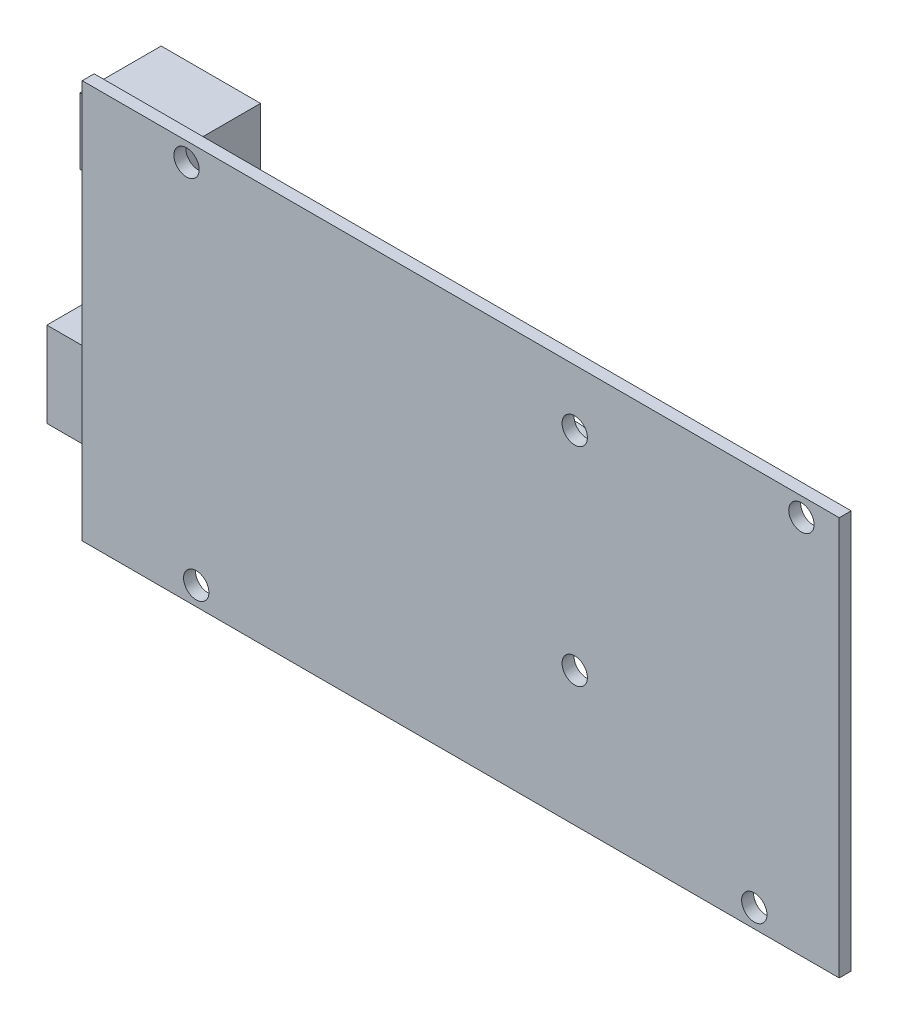
ISO-10303-21;
HEADER;
FILE_DESCRIPTION(('STEP AP214'),'2;1');
FILE_NAME('part.step','',(''),(''),'','','');
FILE_SCHEMA(('AUTOMOTIVE_DESIGN { 1 0 10303 214 1 1 1 1 }'));
ENDSEC;
DATA;
#1=APPLICATION_CONTEXT('core data for automotive mechanical design processes');
#2=APPLICATION_PROTOCOL_DEFINITION('international standard','automotive_design',2000,#1);
#3=PRODUCT_CONTEXT('',#1,'mechanical');
#4=PRODUCT('Part','Part','',(#3));
#5=PRODUCT_RELATED_PRODUCT_CATEGORY('part','',(#4));
#6=PRODUCT_DEFINITION_FORMATION('','',#4);
#7=PRODUCT_DEFINITION_CONTEXT('part definition',#1,'design');
#8=PRODUCT_DEFINITION('design','',#6,#7);
#9=PRODUCT_DEFINITION_SHAPE('','',#8);
#10=(LENGTH_UNIT() NAMED_UNIT(*) SI_UNIT(.MILLI.,.METRE.));
#11=(NAMED_UNIT(*) PLANE_ANGLE_UNIT() SI_UNIT($,.RADIAN.));
#12=(NAMED_UNIT(*) SI_UNIT($,.STERADIAN.) SOLID_ANGLE_UNIT());
#13=UNCERTAINTY_MEASURE_WITH_UNIT(LENGTH_MEASURE(1.E-05),#10,'distance_accuracy_value','');
#14=(GEOMETRIC_REPRESENTATION_CONTEXT(3) GLOBAL_UNCERTAINTY_ASSIGNED_CONTEXT((#13)) GLOBAL_UNIT_ASSIGNED_CONTEXT((#10,
#11,#12)) REPRESENTATION_CONTEXT('',''));
#15=CARTESIAN_POINT('',(0.,0.,0.));
#16=DIRECTION('',(0.,0.,1.));
#17=DIRECTION('',(1.,0.,0.));
#18=AXIS2_PLACEMENT_3D('',#15,#16,#17);
#19=CARTESIAN_POINT('',(0.,0.,0.));
#20=DIRECTION('',(0.,0.,-1.));
#21=DIRECTION('',(-1.,0.,0.));
#22=AXIS2_PLACEMENT_3D('',#19,#20,#21);
#23=PLANE('',#22);
#24=CARTESIAN_POINT('',(0.,0.,0.));
#25=DIRECTION('',(0.,0.,-1.));
#26=DIRECTION('',(-1.,0.,0.));
#27=AXIS2_PLACEMENT_3D('',#24,#25,#26);
#28=CIRCLE('',#27,4.65843090917835);
#29=CARTESIAN_POINT('',(-4.65843090917835,0.,0.));
#30=VERTEX_POINT('',#29);
#31=EDGE_CURVE('E312',#30,#30,#28,.T.);
#32=ORIENTED_EDGE('',*,*,#31,.F.);
#33=EDGE_LOOP('',(#32));
#34=FACE_BOUND('',#33,.T.);
#35=CARTESIAN_POINT('',(15.3,19.1500000000001,0.));
#36=DIRECTION('',(0.,0.,-1.));
#37=DIRECTION('',(-1.,0.,0.));
#38=AXIS2_PLACEMENT_3D('',#35,#36,#37);
#39=CIRCLE('',#38,1.69999999999999);
#40=CARTESIAN_POINT('',(13.6,19.1500000000001,0.));
#41=VERTEX_POINT('',#40);
#42=EDGE_CURVE('E197',#41,#41,#39,.T.);
#43=ORIENTED_EDGE('',*,*,#42,.F.);
#44=EDGE_LOOP('',(#43));
#45=FACE_BOUND('',#44,.T.);
#46=CARTESIAN_POINT('',(45.72,24.2500000000001,0.));
#47=DIRECTION('',(0.,0.,-1.));
#48=DIRECTION('',(-1.,0.,0.));
#49=AXIS2_PLACEMENT_3D('',#46,#47,#48);
#50=CIRCLE('',#49,1.69999999999999);
#51=CARTESIAN_POINT('',(44.02,24.2500000000001,0.));
#52=VERTEX_POINT('',#51);
#53=EDGE_CURVE('E203',#52,#52,#50,.T.);
#54=ORIENTED_EDGE('',*,*,#53,.F.);
#55=EDGE_LOOP('',(#54));
#56=FACE_BOUND('',#55,.T.);
#57=CARTESIAN_POINT('',(15.3,-8.74999999999994,0.));
#58=DIRECTION('',(0.,0.,-1.));
#59=DIRECTION('',(-1.,0.,0.));
#60=AXIS2_PLACEMENT_3D('',#57,#58,#59);
#61=CIRCLE('',#60,1.69999999999999);
#62=CARTESIAN_POINT('',(13.6,-8.74999999999994,0.));
#63=VERTEX_POINT('',#62);
#64=EDGE_CURVE('E209',#63,#63,#61,.T.);
#65=ORIENTED_EDGE('',*,*,#64,.F.);
#66=EDGE_LOOP('',(#65));
#67=FACE_BOUND('',#66,.T.);
#68=CARTESIAN_POINT('',(39.4,-24.25,0.));
#69=DIRECTION('',(0.,0.,-1.));
#70=DIRECTION('',(-1.,0.,0.));
#71=AXIS2_PLACEMENT_3D('',#68,#69,#70);
#72=CIRCLE('',#71,1.69999999999999);
#73=CARTESIAN_POINT('',(37.7,-24.25,0.));
#74=VERTEX_POINT('',#73);
#75=EDGE_CURVE('E215',#74,#74,#72,.T.);
#76=ORIENTED_EDGE('',*,*,#75,.F.);
#77=EDGE_LOOP('',(#76));
#78=FACE_BOUND('',#77,.T.);
#79=CARTESIAN_POINT('',(-35.5,-24.2500000000001,0.));
#80=DIRECTION('',(0.,0.,-1.));
#81=DIRECTION('',(-1.,0.,0.));
#82=AXIS2_PLACEMENT_3D('',#79,#80,#81);
#83=CIRCLE('',#82,1.69999999999999);
#84=CARTESIAN_POINT('',(-37.2,-24.2500000000001,0.));
#85=VERTEX_POINT('',#84);
#86=EDGE_CURVE('E221',#85,#85,#83,.T.);
#87=ORIENTED_EDGE('',*,*,#86,.F.);
#88=EDGE_LOOP('',(#87));
#89=FACE_BOUND('',#88,.T.);
#90=CARTESIAN_POINT('',(-36.8,24.2500000000001,0.));
#91=DIRECTION('',(0.,0.,-1.));
#92=DIRECTION('',(-1.,0.,0.));
#93=AXIS2_PLACEMENT_3D('',#90,#91,#92);
#94=CIRCLE('',#93,1.69999999999999);
#95=CARTESIAN_POINT('',(-38.5,24.2500000000001,0.));
#96=VERTEX_POINT('',#95);
#97=EDGE_CURVE('E227',#96,#96,#94,.T.);
#98=ORIENTED_EDGE('',*,*,#97,.F.);
#99=EDGE_LOOP('',(#98));
#100=FACE_BOUND('',#99,.T.);
#101=DIRECTION('',(0.,-1.,0.));
#102=VECTOR('',#101,1.);
#103=CARTESIAN_POINT('',(-50.8,-26.75,0.));
#104=LINE('',#103,#102);
#105=CARTESIAN_POINT('',(-50.8,14.6850000000001,0.));
#106=VERTEX_POINT('',#105);
#107=CARTESIAN_POINT('',(-50.8,-5.63499999999995,0.));
#108=VERTEX_POINT('',#107);
#109=EDGE_CURVE('E254',#106,#108,#104,.T.);
#110=ORIENTED_EDGE('',*,*,#109,.F.);
#111=DIRECTION('',(-1.,0.,0.));
#112=VECTOR('',#111,1.);
#113=CARTESIAN_POINT('',(-39.37,14.6850000000001,0.));
#114=LINE('',#113,#112);
#115=CARTESIAN_POINT('',(-39.37,14.6850000000001,0.));
#116=VERTEX_POINT('',#115);
#117=EDGE_CURVE('E307',#116,#106,#114,.T.);
#118=ORIENTED_EDGE('',*,*,#117,.F.);
#119=DIRECTION('',(0.,-1.,0.));
#120=VECTOR('',#119,1.);
#121=CARTESIAN_POINT('',(-39.37,14.6850000000001,0.));
#122=LINE('',#121,#120);
#123=CARTESIAN_POINT('',(-39.37,23.575,0.));
#124=VERTEX_POINT('',#123);
#125=EDGE_CURVE('E159',#124,#116,#122,.T.);
#126=ORIENTED_EDGE('',*,*,#125,.F.);
#127=DIRECTION('',(-1.,0.,0.));
#128=VECTOR('',#127,1.);
#129=CARTESIAN_POINT('',(0.,23.575,0.));
#130=LINE('',#129,#128);
#131=CARTESIAN_POINT('',(-50.8,23.5750000000001,0.));
#132=VERTEX_POINT('',#131);
#133=EDGE_CURVE('E11',#124,#132,#130,.T.);
#134=ORIENTED_EDGE('',*,*,#133,.T.);
#135=CARTESIAN_POINT('',(-50.8,26.75,0.));
#136=VERTEX_POINT('',#135);
#137=EDGE_CURVE('E250',#136,#132,#104,.T.);
#138=ORIENTED_EDGE('',*,*,#137,.F.);
#139=DIRECTION('',(-1.,0.,0.));
#140=VECTOR('',#139,1.);
#141=CARTESIAN_POINT('',(-50.8,26.75,0.));
#142=LINE('',#141,#140);
#143=CARTESIAN_POINT('',(50.8,26.75,0.));
#144=VERTEX_POINT('',#143);
#145=EDGE_CURVE('E247',#144,#136,#142,.T.);
#146=ORIENTED_EDGE('',*,*,#145,.F.);
#147=DIRECTION('',(0.,1.,0.));
#148=VECTOR('',#147,1.);
#149=CARTESIAN_POINT('',(50.8,-26.75,0.));
#150=LINE('',#149,#148);
#151=CARTESIAN_POINT('',(50.8,-26.75,0.));
#152=VERTEX_POINT('',#151);
#153=EDGE_CURVE('E233',#152,#144,#150,.T.);
#154=ORIENTED_EDGE('',*,*,#153,.F.);
#155=DIRECTION('',(1.,0.,0.));
#156=VECTOR('',#155,1.);
#157=CARTESIAN_POINT('',(-50.8,-26.75,0.));
#158=LINE('',#157,#156);
#159=CARTESIAN_POINT('',(-50.8,-26.75,0.));
#160=VERTEX_POINT('',#159);
#161=EDGE_CURVE('E238',#160,#152,#158,.T.);
#162=ORIENTED_EDGE('',*,*,#161,.F.);
#163=CARTESIAN_POINT('',(-50.8,-17.0649999999999,0.));
#164=VERTEX_POINT('',#163);
#165=EDGE_CURVE('E249',#164,#160,#104,.T.);
#166=ORIENTED_EDGE('',*,*,#165,.F.);
#167=DIRECTION('',(-1.,0.,0.));
#168=VECTOR('',#167,1.);
#169=CARTESIAN_POINT('',(-41.275,-17.0649999999999,0.));
#170=LINE('',#169,#168);
#171=CARTESIAN_POINT('',(-41.275,-17.0649999999999,0.));
#172=VERTEX_POINT('',#171);
#173=EDGE_CURVE('E179',#172,#164,#170,.T.);
#174=ORIENTED_EDGE('',*,*,#173,.F.);
#175=DIRECTION('',(0.,-1.,0.));
#176=VECTOR('',#175,1.);
#177=CARTESIAN_POINT('',(-41.275,-17.0649999999999,0.));
#178=LINE('',#177,#176);
#179=CARTESIAN_POINT('',(-41.275,-5.63499999999995,0.));
#180=VERTEX_POINT('',#179);
#181=EDGE_CURVE('E56',#180,#172,#178,.T.);
#182=ORIENTED_EDGE('',*,*,#181,.F.);
#183=DIRECTION('',(1.,0.,0.));
#184=VECTOR('',#183,1.);
#185=CARTESIAN_POINT('',(-41.275,-5.63499999999995,0.));
#186=LINE('',#185,#184);
#187=EDGE_CURVE('E41',#108,#180,#186,.T.);
#188=ORIENTED_EDGE('',*,*,#187,.F.);
#189=EDGE_LOOP('',(#110,#118,#126,#134,#138,#146,#154,#162,#166,#174,#182,#188));
#190=FACE_BOUND('',#189,.T.);
#191=ADVANCED_FACE('F33',(#34,#45,#56,#67,#78,#89,#100,#190),#23,.T.);
#192=CARTESIAN_POINT('',(50.8,-26.75,1.6));
#193=DIRECTION('',(-1.,0.,0.));
#194=DIRECTION('',(0.,0.,1.));
#195=AXIS2_PLACEMENT_3D('',#192,#193,#194);
#196=PLANE('',#195);
#197=ORIENTED_EDGE('',*,*,#153,.T.);
#198=DIRECTION('',(0.,0.,-1.));
#199=VECTOR('',#198,1.);
#200=CARTESIAN_POINT('',(50.8,26.75,1.6));
#201=LINE('',#200,#199);
#202=CARTESIAN_POINT('',(50.8,26.75,1.6));
#203=VERTEX_POINT('',#202);
#204=EDGE_CURVE('E264',#203,#144,#201,.T.);
#205=ORIENTED_EDGE('',*,*,#204,.F.);
#206=DIRECTION('',(0.,1.,0.));
#207=VECTOR('',#206,1.);
#208=CARTESIAN_POINT('',(50.8,-26.75,1.6));
#209=LINE('',#208,#207);
#210=CARTESIAN_POINT('',(50.8,-26.75,1.6));
#211=VERTEX_POINT('',#210);
#212=EDGE_CURVE('E234',#211,#203,#209,.T.);
#213=ORIENTED_EDGE('',*,*,#212,.F.);
#214=DIRECTION('',(0.,0.,-1.));
#215=VECTOR('',#214,1.);
#216=CARTESIAN_POINT('',(50.8,-26.75,1.6));
#217=LINE('',#216,#215);
#218=EDGE_CURVE('E244',#211,#152,#217,.T.);
#219=ORIENTED_EDGE('',*,*,#218,.T.);
#220=EDGE_LOOP('',(#197,#205,#213,#219));
#221=FACE_BOUND('',#220,.T.);
#222=ADVANCED_FACE('F35',(#221),#196,.F.);
#223=CARTESIAN_POINT('',(-50.8,26.75,1.6));
#224=DIRECTION('',(0.,-1.,0.));
#225=DIRECTION('',(0.,0.,-1.));
#226=AXIS2_PLACEMENT_3D('',#223,#224,#225);
#227=PLANE('',#226);
#228=ORIENTED_EDGE('',*,*,#145,.T.);
#229=DIRECTION('',(0.,0.,-1.));
#230=VECTOR('',#229,1.);
#231=CARTESIAN_POINT('',(-50.8,26.75,1.6));
#232=LINE('',#231,#230);
#233=CARTESIAN_POINT('',(-50.8,26.75,1.6));
#234=VERTEX_POINT('',#233);
#235=EDGE_CURVE('E262',#234,#136,#232,.T.);
#236=ORIENTED_EDGE('',*,*,#235,.F.);
#237=DIRECTION('',(-1.,0.,0.));
#238=VECTOR('',#237,1.);
#239=CARTESIAN_POINT('',(-50.8,26.75,1.6));
#240=LINE('',#239,#238);
#241=EDGE_CURVE('E237',#203,#234,#240,.T.);
#242=ORIENTED_EDGE('',*,*,#241,.F.);
#243=ORIENTED_EDGE('',*,*,#204,.T.);
#244=EDGE_LOOP('',(#228,#236,#242,#243));
#245=FACE_BOUND('',#244,.T.);
#246=ADVANCED_FACE('F364',(#245),#227,.F.);
#247=CARTESIAN_POINT('',(-50.8,-26.75,1.6));
#248=DIRECTION('',(1.,0.,0.));
#249=DIRECTION('',(0.,0.,-1.));
#250=AXIS2_PLACEMENT_3D('',#247,#248,#249);
#251=PLANE('',#250);
#252=ORIENTED_EDGE('',*,*,#137,.T.);
#253=EDGE_CURVE('E253',#132,#106,#104,.T.);
#254=ORIENTED_EDGE('',*,*,#253,.T.);
#255=ORIENTED_EDGE('',*,*,#109,.T.);
#256=EDGE_CURVE('E255',#108,#164,#104,.T.);
#257=ORIENTED_EDGE('',*,*,#256,.T.);
#258=ORIENTED_EDGE('',*,*,#165,.T.);
#259=DIRECTION('',(0.,0.,-1.));
#260=VECTOR('',#259,1.);
#261=CARTESIAN_POINT('',(-50.8,-26.75,1.6));
#262=LINE('',#261,#260);
#263=CARTESIAN_POINT('',(-50.8,-26.75,1.6));
#264=VERTEX_POINT('',#263);
#265=EDGE_CURVE('E259',#264,#160,#262,.T.);
#266=ORIENTED_EDGE('',*,*,#265,.F.);
#267=DIRECTION('',(0.,-1.,0.));
#268=VECTOR('',#267,1.);
#269=CARTESIAN_POINT('',(-50.8,-26.75,1.6));
#270=LINE('',#269,#268);
#271=EDGE_CURVE('E240',#234,#264,#270,.T.);
#272=ORIENTED_EDGE('',*,*,#271,.F.);
#273=ORIENTED_EDGE('',*,*,#235,.T.);
#274=EDGE_LOOP('',(#252,#254,#255,#257,#258,#266,#272,#273));
#275=FACE_BOUND('',#274,.T.);
#276=ADVANCED_FACE('F293',(#275),#251,.F.);
#277=CARTESIAN_POINT('',(-50.8,-26.75,1.6));
#278=DIRECTION('',(0.,1.,0.));
#279=DIRECTION('',(0.,0.,1.));
#280=AXIS2_PLACEMENT_3D('',#277,#278,#279);
#281=PLANE('',#280);
#282=ORIENTED_EDGE('',*,*,#161,.T.);
#283=ORIENTED_EDGE('',*,*,#218,.F.);
#284=DIRECTION('',(1.,0.,0.));
#285=VECTOR('',#284,1.);
#286=CARTESIAN_POINT('',(-50.8,-26.75,1.6));
#287=LINE('',#286,#285);
#288=EDGE_CURVE('E242',#264,#211,#287,.T.);
#289=ORIENTED_EDGE('',*,*,#288,.F.);
#290=ORIENTED_EDGE('',*,*,#265,.T.);
#291=EDGE_LOOP('',(#282,#283,#289,#290));
#292=FACE_BOUND('',#291,.T.);
#293=ADVANCED_FACE('F354',(#292),#281,.F.);
#294=CARTESIAN_POINT('',(0.,0.,1.6));
#295=DIRECTION('',(0.,0.,-1.));
#296=DIRECTION('',(-1.,0.,0.));
#297=AXIS2_PLACEMENT_3D('',#294,#295,#296);
#298=PLANE('',#297);
#299=CARTESIAN_POINT('',(15.3,19.1500000000001,1.6));
#300=DIRECTION('',(0.,0.,-1.));
#301=DIRECTION('',(-1.,0.,0.));
#302=AXIS2_PLACEMENT_3D('',#299,#300,#301);
#303=CIRCLE('',#302,1.7);
#304=CARTESIAN_POINT('',(13.6,19.1500000000001,1.6));
#305=VERTEX_POINT('',#304);
#306=EDGE_CURVE('E200',#305,#305,#303,.T.);
#307=ORIENTED_EDGE('',*,*,#306,.T.);
#308=EDGE_LOOP('',(#307));
#309=FACE_BOUND('',#308,.T.);
#310=CARTESIAN_POINT('',(45.72,24.2500000000001,1.6));
#311=DIRECTION('',(0.,0.,-1.));
#312=DIRECTION('',(-1.,0.,0.));
#313=AXIS2_PLACEMENT_3D('',#310,#311,#312);
#314=CIRCLE('',#313,1.7);
#315=CARTESIAN_POINT('',(44.02,24.2500000000001,1.6));
#316=VERTEX_POINT('',#315);
#317=EDGE_CURVE('E206',#316,#316,#314,.T.);
#318=ORIENTED_EDGE('',*,*,#317,.T.);
#319=EDGE_LOOP('',(#318));
#320=FACE_BOUND('',#319,.T.);
#321=CARTESIAN_POINT('',(15.3,-8.74999999999994,1.6));
#322=DIRECTION('',(0.,0.,-1.));
#323=DIRECTION('',(-1.,0.,0.));
#324=AXIS2_PLACEMENT_3D('',#321,#322,#323);
#325=CIRCLE('',#324,1.7);
#326=CARTESIAN_POINT('',(13.6,-8.74999999999994,1.6));
#327=VERTEX_POINT('',#326);
#328=EDGE_CURVE('E212',#327,#327,#325,.T.);
#329=ORIENTED_EDGE('',*,*,#328,.T.);
#330=EDGE_LOOP('',(#329));
#331=FACE_BOUND('',#330,.T.);
#332=CARTESIAN_POINT('',(39.4,-24.25,1.6));
#333=DIRECTION('',(0.,0.,-1.));
#334=DIRECTION('',(-1.,0.,0.));
#335=AXIS2_PLACEMENT_3D('',#332,#333,#334);
#336=CIRCLE('',#335,1.7);
#337=CARTESIAN_POINT('',(37.7,-24.25,1.6));
#338=VERTEX_POINT('',#337);
#339=EDGE_CURVE('E218',#338,#338,#336,.T.);
#340=ORIENTED_EDGE('',*,*,#339,.T.);
#341=EDGE_LOOP('',(#340));
#342=FACE_BOUND('',#341,.T.);
#343=CARTESIAN_POINT('',(-35.5,-24.2500000000001,1.6));
#344=DIRECTION('',(0.,0.,-1.));
#345=DIRECTION('',(-1.,0.,0.));
#346=AXIS2_PLACEMENT_3D('',#343,#344,#345);
#347=CIRCLE('',#346,1.7);
#348=CARTESIAN_POINT('',(-37.2,-24.2500000000001,1.6));
#349=VERTEX_POINT('',#348);
#350=EDGE_CURVE('E224',#349,#349,#347,.T.);
#351=ORIENTED_EDGE('',*,*,#350,.T.);
#352=EDGE_LOOP('',(#351));
#353=FACE_BOUND('',#352,.T.);
#354=CARTESIAN_POINT('',(-36.8,24.2500000000001,1.6));
#355=DIRECTION('',(0.,0.,-1.));
#356=DIRECTION('',(-1.,0.,0.));
#357=AXIS2_PLACEMENT_3D('',#354,#355,#356);
#358=CIRCLE('',#357,1.7);
#359=CARTESIAN_POINT('',(-38.5,24.2500000000001,1.6));
#360=VERTEX_POINT('',#359);
#361=EDGE_CURVE('E230',#360,#360,#358,.T.);
#362=ORIENTED_EDGE('',*,*,#361,.T.);
#363=EDGE_LOOP('',(#362));
#364=FACE_BOUND('',#363,.T.);
#365=ORIENTED_EDGE('',*,*,#212,.T.);
#366=ORIENTED_EDGE('',*,*,#241,.T.);
#367=ORIENTED_EDGE('',*,*,#271,.T.);
#368=ORIENTED_EDGE('',*,*,#288,.T.);
#369=EDGE_LOOP('',(#365,#366,#367,#368));
#370=FACE_BOUND('',#369,.T.);
#371=ADVANCED_FACE('F344',(#309,#320,#331,#342,#353,#364,#370),#298,.F.);
#372=CARTESIAN_POINT('',(-36.8,24.2500000000001,0.));
#373=DIRECTION('',(0.,0.,-1.));
#374=DIRECTION('',(-1.,0.,0.));
#375=AXIS2_PLACEMENT_3D('',#372,#373,#374);
#376=CYLINDRICAL_SURFACE('',#375,1.7);
#377=ORIENTED_EDGE('',*,*,#361,.F.);
#378=EDGE_LOOP('',(#377));
#379=FACE_BOUND('',#378,.T.);
#380=ORIENTED_EDGE('',*,*,#97,.T.);
#381=EDGE_LOOP('',(#380));
#382=FACE_BOUND('',#381,.T.);
#383=ADVANCED_FACE('F341',(#379,#382),#376,.F.);
#384=CARTESIAN_POINT('',(-35.5,-24.2500000000001,0.));
#385=DIRECTION('',(0.,0.,-1.));
#386=DIRECTION('',(-1.,0.,0.));
#387=AXIS2_PLACEMENT_3D('',#384,#385,#386);
#388=CYLINDRICAL_SURFACE('',#387,1.7);
#389=ORIENTED_EDGE('',*,*,#350,.F.);
#390=EDGE_LOOP('',(#389));
#391=FACE_BOUND('',#390,.T.);
#392=ORIENTED_EDGE('',*,*,#86,.T.);
#393=EDGE_LOOP('',(#392));
#394=FACE_BOUND('',#393,.T.);
#395=ADVANCED_FACE('F343',(#391,#394),#388,.F.);
#396=CARTESIAN_POINT('',(39.4,-24.25,0.));
#397=DIRECTION('',(0.,0.,-1.));
#398=DIRECTION('',(-1.,0.,0.));
#399=AXIS2_PLACEMENT_3D('',#396,#397,#398);
#400=CYLINDRICAL_SURFACE('',#399,1.7);
#401=ORIENTED_EDGE('',*,*,#339,.F.);
#402=EDGE_LOOP('',(#401));
#403=FACE_BOUND('',#402,.T.);
#404=ORIENTED_EDGE('',*,*,#75,.T.);
#405=EDGE_LOOP('',(#404));
#406=FACE_BOUND('',#405,.T.);
#407=ADVANCED_FACE('F351',(#403,#406),#400,.F.);
#408=CARTESIAN_POINT('',(15.3,-8.74999999999994,0.));
#409=DIRECTION('',(0.,0.,-1.));
#410=DIRECTION('',(-1.,0.,0.));
#411=AXIS2_PLACEMENT_3D('',#408,#409,#410);
#412=CYLINDRICAL_SURFACE('',#411,1.7);
#413=ORIENTED_EDGE('',*,*,#328,.F.);
#414=EDGE_LOOP('',(#413));
#415=FACE_BOUND('',#414,.T.);
#416=ORIENTED_EDGE('',*,*,#64,.T.);
#417=EDGE_LOOP('',(#416));
#418=FACE_BOUND('',#417,.T.);
#419=ADVANCED_FACE('F400',(#415,#418),#412,.F.);
#420=CARTESIAN_POINT('',(45.72,24.2500000000001,0.));
#421=DIRECTION('',(0.,0.,-1.));
#422=DIRECTION('',(-1.,0.,0.));
#423=AXIS2_PLACEMENT_3D('',#420,#421,#422);
#424=CYLINDRICAL_SURFACE('',#423,1.7);
#425=ORIENTED_EDGE('',*,*,#317,.F.);
#426=EDGE_LOOP('',(#425));
#427=FACE_BOUND('',#426,.T.);
#428=ORIENTED_EDGE('',*,*,#53,.T.);
#429=EDGE_LOOP('',(#428));
#430=FACE_BOUND('',#429,.T.);
#431=ADVANCED_FACE('F396',(#427,#430),#424,.F.);
#432=CARTESIAN_POINT('',(15.3,19.1500000000001,0.));
#433=DIRECTION('',(0.,0.,-1.));
#434=DIRECTION('',(-1.,0.,0.));
#435=AXIS2_PLACEMENT_3D('',#432,#433,#434);
#436=CYLINDRICAL_SURFACE('',#435,1.7);
#437=ORIENTED_EDGE('',*,*,#306,.F.);
#438=EDGE_LOOP('',(#437));
#439=FACE_BOUND('',#438,.T.);
#440=ORIENTED_EDGE('',*,*,#42,.T.);
#441=EDGE_LOOP('',(#440));
#442=FACE_BOUND('',#441,.T.);
#443=ADVANCED_FACE('F393',(#439,#442),#436,.F.);
#444=CARTESIAN_POINT('',(0.,0.,0.));
#445=DIRECTION('',(0.,0.,1.));
#446=DIRECTION('',(1.,0.,0.));
#447=AXIS2_PLACEMENT_3D('',#444,#445,#446);
#448=PLANE('',#447);
#449=ORIENTED_EDGE('',*,*,#256,.F.);
#450=CARTESIAN_POINT('',(-57.15,-5.63499999999995,0.));
#451=VERTEX_POINT('',#450);
#452=EDGE_CURVE('E172',#451,#108,#186,.T.);
#453=ORIENTED_EDGE('',*,*,#452,.F.);
#454=DIRECTION('',(0.,1.,0.));
#455=VECTOR('',#454,1.);
#456=CARTESIAN_POINT('',(-57.15,-17.0649999999999,0.));
#457=LINE('',#456,#455);
#458=CARTESIAN_POINT('',(-57.15,-17.0649999999999,0.));
#459=VERTEX_POINT('',#458);
#460=EDGE_CURVE('E182',#459,#451,#457,.T.);
#461=ORIENTED_EDGE('',*,*,#460,.F.);
#462=EDGE_CURVE('E162',#164,#459,#170,.T.);
#463=ORIENTED_EDGE('',*,*,#462,.F.);
#464=EDGE_LOOP('',(#449,#453,#461,#463));
#465=FACE_BOUND('',#464,.T.);
#466=ADVANCED_FACE('F287',(#465),#448,.T.);
#467=CARTESIAN_POINT('',(-41.275,-17.0649999999999,-10.9));
#468=DIRECTION('',(-1.,0.,0.));
#469=DIRECTION('',(0.,0.,1.));
#470=AXIS2_PLACEMENT_3D('',#467,#468,#469);
#471=PLANE('',#470);
#472=ORIENTED_EDGE('',*,*,#181,.T.);
#473=DIRECTION('',(0.,0.,1.));
#474=VECTOR('',#473,1.);
#475=CARTESIAN_POINT('',(-41.275,-17.0649999999999,-10.9));
#476=LINE('',#475,#474);
#477=CARTESIAN_POINT('',(-41.275,-17.0649999999999,-10.9));
#478=VERTEX_POINT('',#477);
#479=EDGE_CURVE('E194',#478,#172,#476,.T.);
#480=ORIENTED_EDGE('',*,*,#479,.F.);
#481=DIRECTION('',(0.,-1.,0.));
#482=VECTOR('',#481,1.);
#483=CARTESIAN_POINT('',(-41.275,-17.0649999999999,-10.9));
#484=LINE('',#483,#482);
#485=CARTESIAN_POINT('',(-41.275,-5.63499999999995,-10.9));
#486=VERTEX_POINT('',#485);
#487=EDGE_CURVE('E168',#486,#478,#484,.T.);
#488=ORIENTED_EDGE('',*,*,#487,.F.);
#489=DIRECTION('',(0.,0.,1.));
#490=VECTOR('',#489,1.);
#491=CARTESIAN_POINT('',(-41.275,-5.63499999999995,-10.9));
#492=LINE('',#491,#490);
#493=EDGE_CURVE('E177',#486,#180,#492,.T.);
#494=ORIENTED_EDGE('',*,*,#493,.T.);
#495=EDGE_LOOP('',(#472,#480,#488,#494));
#496=FACE_BOUND('',#495,.T.);
#497=ADVANCED_FACE('F277',(#496),#471,.F.);
#498=CARTESIAN_POINT('',(-41.275,-17.0649999999999,-10.9));
#499=DIRECTION('',(0.,1.,0.));
#500=DIRECTION('',(0.,0.,1.));
#501=AXIS2_PLACEMENT_3D('',#498,#499,#500);
#502=PLANE('',#501);
#503=ORIENTED_EDGE('',*,*,#173,.T.);
#504=ORIENTED_EDGE('',*,*,#462,.T.);
#505=DIRECTION('',(0.,0.,1.));
#506=VECTOR('',#505,1.);
#507=CARTESIAN_POINT('',(-57.15,-17.0649999999999,-10.9));
#508=LINE('',#507,#506);
#509=CARTESIAN_POINT('',(-57.15,-17.0649999999999,-10.9));
#510=VERTEX_POINT('',#509);
#511=EDGE_CURVE('E191',#510,#459,#508,.T.);
#512=ORIENTED_EDGE('',*,*,#511,.F.);
#513=DIRECTION('',(-1.,0.,0.));
#514=VECTOR('',#513,1.);
#515=CARTESIAN_POINT('',(-41.275,-17.0649999999999,-10.9));
#516=LINE('',#515,#514);
#517=EDGE_CURVE('E171',#478,#510,#516,.T.);
#518=ORIENTED_EDGE('',*,*,#517,.F.);
#519=ORIENTED_EDGE('',*,*,#479,.T.);
#520=EDGE_LOOP('',(#503,#504,#512,#518,#519));
#521=FACE_BOUND('',#520,.T.);
#522=ADVANCED_FACE('F379',(#521),#502,.F.);
#523=CARTESIAN_POINT('',(-57.15,-17.0649999999999,-10.9));
#524=DIRECTION('',(1.,0.,0.));
#525=DIRECTION('',(0.,0.,-1.));
#526=AXIS2_PLACEMENT_3D('',#523,#524,#525);
#527=PLANE('',#526);
#528=ORIENTED_EDGE('',*,*,#460,.T.);
#529=DIRECTION('',(0.,0.,1.));
#530=VECTOR('',#529,1.);
#531=CARTESIAN_POINT('',(-57.15,-5.63499999999995,-10.9));
#532=LINE('',#531,#530);
#533=CARTESIAN_POINT('',(-57.15,-5.63499999999995,-10.9));
#534=VERTEX_POINT('',#533);
#535=EDGE_CURVE('E188',#534,#451,#532,.T.);
#536=ORIENTED_EDGE('',*,*,#535,.F.);
#537=DIRECTION('',(0.,1.,0.));
#538=VECTOR('',#537,1.);
#539=CARTESIAN_POINT('',(-57.15,-17.0649999999999,-10.9));
#540=LINE('',#539,#538);
#541=EDGE_CURVE('E174',#510,#534,#540,.T.);
#542=ORIENTED_EDGE('',*,*,#541,.F.);
#543=ORIENTED_EDGE('',*,*,#511,.T.);
#544=EDGE_LOOP('',(#528,#536,#542,#543));
#545=FACE_BOUND('',#544,.T.);
#546=ADVANCED_FACE('F380',(#545),#527,.F.);
#547=CARTESIAN_POINT('',(-41.275,-5.63499999999995,-10.9));
#548=DIRECTION('',(0.,-1.,0.));
#549=DIRECTION('',(1.,0.,0.));
#550=AXIS2_PLACEMENT_3D('',#547,#548,#549);
#551=PLANE('',#550);
#552=ORIENTED_EDGE('',*,*,#452,.T.);
#553=ORIENTED_EDGE('',*,*,#187,.T.);
#554=ORIENTED_EDGE('',*,*,#493,.F.);
#555=DIRECTION('',(1.,0.,0.));
#556=VECTOR('',#555,1.);
#557=CARTESIAN_POINT('',(-41.275,-5.63499999999995,-10.9));
#558=LINE('',#557,#556);
#559=EDGE_CURVE('E176',#534,#486,#558,.T.);
#560=ORIENTED_EDGE('',*,*,#559,.F.);
#561=ORIENTED_EDGE('',*,*,#535,.T.);
#562=EDGE_LOOP('',(#552,#553,#554,#560,#561));
#563=FACE_BOUND('',#562,.T.);
#564=ADVANCED_FACE('F270',(#563),#551,.F.);
#565=CARTESIAN_POINT('',(0.,0.,-10.9));
#566=DIRECTION('',(0.,0.,1.));
#567=DIRECTION('',(1.,0.,0.));
#568=AXIS2_PLACEMENT_3D('',#565,#566,#567);
#569=PLANE('',#568);
#570=ORIENTED_EDGE('',*,*,#487,.T.);
#571=ORIENTED_EDGE('',*,*,#517,.T.);
#572=ORIENTED_EDGE('',*,*,#541,.T.);
#573=ORIENTED_EDGE('',*,*,#559,.T.);
#574=EDGE_LOOP('',(#570,#571,#572,#573));
#575=FACE_BOUND('',#574,.T.);
#576=ADVANCED_FACE('F280',(#575),#569,.F.);
#577=CARTESIAN_POINT('',(0.,0.,0.));
#578=DIRECTION('',(0.,0.,1.));
#579=DIRECTION('',(1.,0.,0.));
#580=AXIS2_PLACEMENT_3D('',#577,#578,#579);
#581=PLANE('',#580);
#582=ORIENTED_EDGE('',*,*,#253,.F.);
#583=DIRECTION('',(1.,0.,0.));
#584=VECTOR('',#583,1.);
#585=CARTESIAN_POINT('',(-39.37,23.575,0.));
#586=LINE('',#585,#584);
#587=CARTESIAN_POINT('',(-52.705,23.575,0.));
#588=VERTEX_POINT('',#587);
#589=EDGE_CURVE('E48',#588,#132,#586,.T.);
#590=ORIENTED_EDGE('',*,*,#589,.F.);
#591=DIRECTION('',(0.,1.,0.));
#592=VECTOR('',#591,1.);
#593=CARTESIAN_POINT('',(-52.705,14.6850000000001,0.));
#594=LINE('',#593,#592);
#595=CARTESIAN_POINT('',(-52.705,14.6850000000001,0.));
#596=VERTEX_POINT('',#595);
#597=EDGE_CURVE('E305',#596,#588,#594,.T.);
#598=ORIENTED_EDGE('',*,*,#597,.F.);
#599=EDGE_CURVE('E298',#106,#596,#114,.T.);
#600=ORIENTED_EDGE('',*,*,#599,.F.);
#601=EDGE_LOOP('',(#582,#590,#598,#600));
#602=FACE_BOUND('',#601,.T.);
#603=ADVANCED_FACE('F296',(#602),#581,.T.);
#604=CARTESIAN_POINT('',(-39.37,14.6850000000001,-10.9));
#605=DIRECTION('',(-1.,0.,0.));
#606=DIRECTION('',(0.,0.,1.));
#607=AXIS2_PLACEMENT_3D('',#604,#605,#606);
#608=PLANE('',#607);
#609=ORIENTED_EDGE('',*,*,#125,.T.);
#610=DIRECTION('',(0.,0.,1.));
#611=VECTOR('',#610,1.);
#612=CARTESIAN_POINT('',(-39.37,14.6850000000001,-10.9));
#613=LINE('',#612,#611);
#614=CARTESIAN_POINT('',(-39.37,14.6850000000001,-10.9));
#615=VERTEX_POINT('',#614);
#616=EDGE_CURVE('E140',#615,#116,#613,.T.);
#617=ORIENTED_EDGE('',*,*,#616,.F.);
#618=DIRECTION('',(0.,-1.,0.));
#619=VECTOR('',#618,1.);
#620=CARTESIAN_POINT('',(-39.37,14.6850000000001,-10.9));
#621=LINE('',#620,#619);
#622=CARTESIAN_POINT('',(-39.37,23.575,-10.9));
#623=VERTEX_POINT('',#622);
#624=EDGE_CURVE('E147',#623,#615,#621,.T.);
#625=ORIENTED_EDGE('',*,*,#624,.F.);
#626=DIRECTION('',(0.,0.,1.));
#627=VECTOR('',#626,1.);
#628=CARTESIAN_POINT('',(-39.37,23.575,-10.9));
#629=LINE('',#628,#627);
#630=EDGE_CURVE('E300',#623,#124,#629,.T.);
#631=ORIENTED_EDGE('',*,*,#630,.T.);
#632=EDGE_LOOP('',(#609,#617,#625,#631));
#633=FACE_BOUND('',#632,.T.);
#634=ADVANCED_FACE('F157',(#633),#608,.F.);
#635=CARTESIAN_POINT('',(-39.37,14.6850000000001,-10.9));
#636=DIRECTION('',(0.,1.,0.));
#637=DIRECTION('',(0.,0.,1.));
#638=AXIS2_PLACEMENT_3D('',#635,#636,#637);
#639=PLANE('',#638);
#640=ORIENTED_EDGE('',*,*,#117,.T.);
#641=ORIENTED_EDGE('',*,*,#599,.T.);
#642=DIRECTION('',(0.,0.,1.));
#643=VECTOR('',#642,1.);
#644=CARTESIAN_POINT('',(-52.705,14.6850000000001,-10.9));
#645=LINE('',#644,#643);
#646=CARTESIAN_POINT('',(-52.705,14.6850000000001,-10.9));
#647=VERTEX_POINT('',#646);
#648=EDGE_CURVE('E143',#647,#596,#645,.T.);
#649=ORIENTED_EDGE('',*,*,#648,.F.);
#650=DIRECTION('',(-1.,0.,0.));
#651=VECTOR('',#650,1.);
#652=CARTESIAN_POINT('',(-39.37,14.6850000000001,-10.9));
#653=LINE('',#652,#651);
#654=EDGE_CURVE('E135',#615,#647,#653,.T.);
#655=ORIENTED_EDGE('',*,*,#654,.F.);
#656=ORIENTED_EDGE('',*,*,#616,.T.);
#657=EDGE_LOOP('',(#640,#641,#649,#655,#656));
#658=FACE_BOUND('',#657,.T.);
#659=ADVANCED_FACE('F138',(#658),#639,.F.);
#660=CARTESIAN_POINT('',(-52.705,14.6850000000001,-10.9));
#661=DIRECTION('',(1.,0.,0.));
#662=DIRECTION('',(0.,0.,-1.));
#663=AXIS2_PLACEMENT_3D('',#660,#661,#662);
#664=PLANE('',#663);
#665=ORIENTED_EDGE('',*,*,#597,.T.);
#666=DIRECTION('',(0.,0.,1.));
#667=VECTOR('',#666,1.);
#668=CARTESIAN_POINT('',(-52.705,23.575,-10.9));
#669=LINE('',#668,#667);
#670=CARTESIAN_POINT('',(-52.705,23.575,-10.9));
#671=VERTEX_POINT('',#670);
#672=EDGE_CURVE('E164',#671,#588,#669,.T.);
#673=ORIENTED_EDGE('',*,*,#672,.F.);
#674=DIRECTION('',(0.,1.,0.));
#675=VECTOR('',#674,1.);
#676=CARTESIAN_POINT('',(-52.705,14.6850000000001,-10.9));
#677=LINE('',#676,#675);
#678=EDGE_CURVE('E146',#647,#671,#677,.T.);
#679=ORIENTED_EDGE('',*,*,#678,.F.);
#680=ORIENTED_EDGE('',*,*,#648,.T.);
#681=EDGE_LOOP('',(#665,#673,#679,#680));
#682=FACE_BOUND('',#681,.T.);
#683=ADVANCED_FACE('F494',(#682),#664,.F.);
#684=CARTESIAN_POINT('',(-39.37,23.575,-10.9));
#685=DIRECTION('',(0.,-1.,0.));
#686=DIRECTION('',(0.,0.,-1.));
#687=AXIS2_PLACEMENT_3D('',#684,#685,#686);
#688=PLANE('',#687);
#689=ORIENTED_EDGE('',*,*,#589,.T.);
#690=ORIENTED_EDGE('',*,*,#133,.F.);
#691=ORIENTED_EDGE('',*,*,#630,.F.);
#692=DIRECTION('',(1.,0.,0.));
#693=VECTOR('',#692,1.);
#694=CARTESIAN_POINT('',(-39.37,23.575,-10.9));
#695=LINE('',#694,#693);
#696=EDGE_CURVE('E152',#671,#623,#695,.T.);
#697=ORIENTED_EDGE('',*,*,#696,.F.);
#698=ORIENTED_EDGE('',*,*,#672,.T.);
#699=EDGE_LOOP('',(#689,#690,#691,#697,#698));
#700=FACE_BOUND('',#699,.T.);
#701=ADVANCED_FACE('F299',(#700),#688,.F.);
#702=CARTESIAN_POINT('',(0.,0.,-10.9));
#703=DIRECTION('',(0.,0.,1.));
#704=DIRECTION('',(1.,0.,0.));
#705=AXIS2_PLACEMENT_3D('',#702,#703,#704);
#706=PLANE('',#705);
#707=ORIENTED_EDGE('',*,*,#624,.T.);
#708=ORIENTED_EDGE('',*,*,#654,.T.);
#709=ORIENTED_EDGE('',*,*,#678,.T.);
#710=ORIENTED_EDGE('',*,*,#696,.T.);
#711=EDGE_LOOP('',(#707,#708,#709,#710));
#712=FACE_BOUND('',#711,.T.);
#713=ADVANCED_FACE('F150',(#712),#706,.F.);
#714=CARTESIAN_POINT('',(0.,0.,-14.));
#715=DIRECTION('',(0.,0.,1.));
#716=DIRECTION('',(1.,0.,0.));
#717=AXIS2_PLACEMENT_3D('',#714,#715,#716);
#718=CYLINDRICAL_SURFACE('',#717,4.65843090917835);
#719=CARTESIAN_POINT('',(0.,0.,-14.));
#720=DIRECTION('',(0.,0.,-1.));
#721=DIRECTION('',(-1.,0.,0.));
#722=AXIS2_PLACEMENT_3D('',#719,#720,#721);
#723=CIRCLE('',#722,4.65843090917835);
#724=CARTESIAN_POINT('',(-4.65843090917835,0.,-14.));
#725=VERTEX_POINT('',#724);
#726=EDGE_CURVE('E309',#725,#725,#723,.T.);
#727=ORIENTED_EDGE('',*,*,#726,.F.);
#728=EDGE_LOOP('',(#727));
#729=FACE_BOUND('',#728,.T.);
#730=ORIENTED_EDGE('',*,*,#31,.T.);
#731=EDGE_LOOP('',(#730));
#732=FACE_BOUND('',#731,.T.);
#733=ADVANCED_FACE('F320',(#729,#732),#718,.T.);
#734=CARTESIAN_POINT('',(0.,0.,-14.));
#735=DIRECTION('',(0.,0.,-1.));
#736=DIRECTION('',(-1.,0.,0.));
#737=AXIS2_PLACEMENT_3D('',#734,#735,#736);
#738=PLANE('',#737);
#739=ORIENTED_EDGE('',*,*,#726,.T.);
#740=EDGE_LOOP('',(#739));
#741=FACE_BOUND('',#740,.T.);
#742=ADVANCED_FACE('F318',(#741),#738,.T.);
#743=CLOSED_SHELL('',(#191,#222,#246,#276,#293,#371,#383,#395,#407,#419,#431,#443,#466,#497,
#522,#546,#564,#576,#603,#634,#659,#683,#701,#713,#733,#742));
#744=MANIFOLD_SOLID_BREP('B2',#743);
#745=ADVANCED_BREP_SHAPE_REPRESENTATION('',(#18,#744),#14);
#746=SHAPE_DEFINITION_REPRESENTATION(#9,#745);
ENDSEC;
END-ISO-10303-21;
